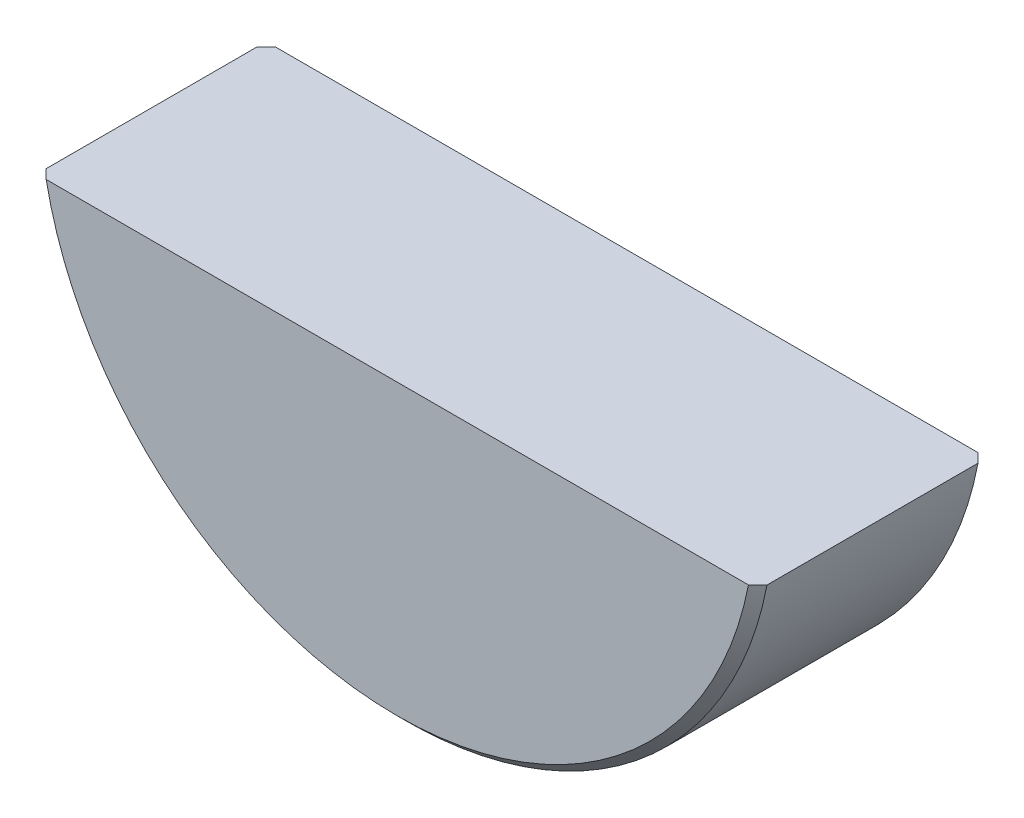
ISO-10303-21;
HEADER;
FILE_DESCRIPTION(('STEP AP214'),'2;1');
FILE_NAME('part.step','',(''),(''),'','','');
FILE_SCHEMA(('AUTOMOTIVE_DESIGN { 1 0 10303 214 1 1 1 1 }'));
ENDSEC;
DATA;
#1=APPLICATION_CONTEXT('core data for automotive mechanical design processes');
#2=APPLICATION_PROTOCOL_DEFINITION('international standard','automotive_design',2000,#1);
#3=PRODUCT_CONTEXT('',#1,'mechanical');
#4=PRODUCT('Part','Part','',(#3));
#5=PRODUCT_RELATED_PRODUCT_CATEGORY('part','',(#4));
#6=PRODUCT_DEFINITION_FORMATION('','',#4);
#7=PRODUCT_DEFINITION_CONTEXT('part definition',#1,'design');
#8=PRODUCT_DEFINITION('design','',#6,#7);
#9=PRODUCT_DEFINITION_SHAPE('','',#8);
#10=(LENGTH_UNIT() NAMED_UNIT(*) SI_UNIT(.MILLI.,.METRE.));
#11=(NAMED_UNIT(*) PLANE_ANGLE_UNIT() SI_UNIT($,.RADIAN.));
#12=(NAMED_UNIT(*) SI_UNIT($,.STERADIAN.) SOLID_ANGLE_UNIT());
#13=UNCERTAINTY_MEASURE_WITH_UNIT(LENGTH_MEASURE(1.E-05),#10,'distance_accuracy_value','');
#14=(GEOMETRIC_REPRESENTATION_CONTEXT(3) GLOBAL_UNCERTAINTY_ASSIGNED_CONTEXT((#13)) GLOBAL_UNIT_ASSIGNED_CONTEXT((#10,
#11,#12)) REPRESENTATION_CONTEXT('',''));
#15=CARTESIAN_POINT('',(0.,0.,0.));
#16=DIRECTION('',(0.,0.,1.));
#17=DIRECTION('',(1.,0.,0.));
#18=AXIS2_PLACEMENT_3D('',#15,#16,#17);
#19=CARTESIAN_POINT('',(0.,0.,10.));
#20=DIRECTION('',(0.,0.,-1.));
#21=DIRECTION('',(-1.,0.,0.));
#22=AXIS2_PLACEMENT_3D('',#19,#20,#21);
#23=CYLINDRICAL_SURFACE('',#22,16.);
#24=DIRECTION('',(0.,0.,-1.));
#25=VECTOR('',#24,1.);
#26=CARTESIAN_POINT('',(-15.7162336455017,-3.,10.));
#27=LINE('',#26,#25);
#28=CARTESIAN_POINT('',(-15.7162336455017,-3.,9.60000000000001));
#29=VERTEX_POINT('',#28);
#30=CARTESIAN_POINT('',(-15.7162336455017,-3.,0.399999999999999));
#31=VERTEX_POINT('',#30);
#32=EDGE_CURVE('E94',#29,#31,#27,.T.);
#33=ORIENTED_EDGE('',*,*,#32,.T.);
#34=CARTESIAN_POINT('',(0.,0.,0.399999999999999));
#35=DIRECTION('',(0.,0.,1.));
#36=DIRECTION('',(1.,0.,0.));
#37=AXIS2_PLACEMENT_3D('',#34,#35,#36);
#38=CIRCLE('',#37,16.);
#39=CARTESIAN_POINT('',(15.7162336455017,-3.,0.399999999999999));
#40=VERTEX_POINT('',#39);
#41=EDGE_CURVE('E93',#31,#40,#38,.T.);
#42=ORIENTED_EDGE('',*,*,#41,.T.);
#43=DIRECTION('',(0.,0.,-1.));
#44=VECTOR('',#43,1.);
#45=CARTESIAN_POINT('',(15.7162336455017,-3.,10.));
#46=LINE('',#45,#44);
#47=CARTESIAN_POINT('',(15.7162336455017,-3.,9.60000000000001));
#48=VERTEX_POINT('',#47);
#49=EDGE_CURVE('E84',#48,#40,#46,.T.);
#50=ORIENTED_EDGE('',*,*,#49,.F.);
#51=CARTESIAN_POINT('',(0.,0.,9.60000000000001));
#52=DIRECTION('',(0.,0.,1.));
#53=DIRECTION('',(1.,0.,0.));
#54=AXIS2_PLACEMENT_3D('',#51,#52,#53);
#55=CIRCLE('',#54,16.);
#56=EDGE_CURVE('E91',#48,#29,#55,.F.);
#57=ORIENTED_EDGE('',*,*,#56,.T.);
#58=EDGE_LOOP('',(#33,#42,#50,#57));
#59=FACE_BOUND('',#58,.T.);
#60=ADVANCED_FACE('F40',(#59),#23,.T.);
#61=CARTESIAN_POINT('',(-15.7162336455017,-3.,10.));
#62=DIRECTION('',(0.,-1.,0.));
#63=DIRECTION('',(0.,0.,-1.));
#64=AXIS2_PLACEMENT_3D('',#61,#62,#63);
#65=PLANE('',#64);
#66=ORIENTED_EDGE('',*,*,#49,.T.);
#67=CARTESIAN_POINT('',(15.7162336455017,-3.,0.399999999999999));
#68=CARTESIAN_POINT('',(15.6483473164627,-3.,0.333317260136937));
#69=CARTESIAN_POINT('',(15.5804530970414,-3.,0.266642556877982));
#70=CARTESIAN_POINT('',(15.4446488774101,-3.,0.133309223544644));
#71=CARTESIAN_POINT('',(15.3767388772001,-3.,0.0666505934702655));
#72=CARTESIAN_POINT('',(15.3088209866077,-3.,0.));
#73=B_SPLINE_CURVE_WITH_KNOTS('',3,(#67,#68,#69,#70,#71,#72),.UNSPECIFIED.,.F.,.F.,(4,2,4),(0.,
0.28547551518384,0.57095103046892),.UNSPECIFIED.);
#74=CARTESIAN_POINT('',(15.3088209866077,-3.,0.));
#75=VERTEX_POINT('',#74);
#76=EDGE_CURVE('E125',#40,#75,#73,.T.);
#77=ORIENTED_EDGE('',*,*,#76,.T.);
#78=DIRECTION('',(-1.,0.,0.));
#79=VECTOR('',#78,1.);
#80=CARTESIAN_POINT('',(-15.7162336455017,-3.,0.));
#81=LINE('',#80,#79);
#82=CARTESIAN_POINT('',(-15.3088209866077,-3.,0.));
#83=VERTEX_POINT('',#82);
#84=EDGE_CURVE('E178',#75,#83,#81,.T.);
#85=ORIENTED_EDGE('',*,*,#84,.T.);
#86=CARTESIAN_POINT('',(-15.3088209866077,-3.,0.));
#87=CARTESIAN_POINT('',(-15.3767388772001,-3.,0.0666505934702665));
#88=CARTESIAN_POINT('',(-15.4446488774101,-3.,0.133309223544645));
#89=CARTESIAN_POINT('',(-15.5804530970414,-3.,0.266642556877984));
#90=CARTESIAN_POINT('',(-15.6483473164627,-3.,0.333317260136938));
#91=CARTESIAN_POINT('',(-15.7162336455017,-3.,0.399999999999999));
#92=B_SPLINE_CURVE_WITH_KNOTS('',3,(#86,#87,#88,#89,#90,#91),.UNSPECIFIED.,.F.,.F.,(4,2,4),(0.,
0.285475515285079,0.570951030468918),.UNSPECIFIED.);
#93=EDGE_CURVE('E86',#83,#31,#92,.T.);
#94=ORIENTED_EDGE('',*,*,#93,.T.);
#95=ORIENTED_EDGE('',*,*,#32,.F.);
#96=CARTESIAN_POINT('',(-15.7162336455017,-3.,9.60000000000001));
#97=CARTESIAN_POINT('',(-15.6483473164627,-3.,9.66668273986307));
#98=CARTESIAN_POINT('',(-15.5804530970414,-3.,9.73335744312202));
#99=CARTESIAN_POINT('',(-15.4446488774101,-3.,9.86669077645536));
#100=CARTESIAN_POINT('',(-15.3767388772001,-3.,9.93334940652974));
#101=CARTESIAN_POINT('',(-15.3088209866077,-3.,10.));
#102=B_SPLINE_CURVE_WITH_KNOTS('',3,(#96,#97,#98,#99,#100,#101),.UNSPECIFIED.,.F.,.F.,(4,2,4),
(0.,0.285475515183831,0.570951030468905),.UNSPECIFIED.);
#103=CARTESIAN_POINT('',(-15.3088209866077,-3.,10.));
#104=VERTEX_POINT('',#103);
#105=EDGE_CURVE('E56',#29,#104,#102,.T.);
#106=ORIENTED_EDGE('',*,*,#105,.T.);
#107=DIRECTION('',(-1.,0.,0.));
#108=VECTOR('',#107,1.);
#109=CARTESIAN_POINT('',(-15.7162336455017,-3.,10.));
#110=LINE('',#109,#108);
#111=CARTESIAN_POINT('',(15.3088209866077,-3.,10.));
#112=VERTEX_POINT('',#111);
#113=EDGE_CURVE('E85',#112,#104,#110,.T.);
#114=ORIENTED_EDGE('',*,*,#113,.F.);
#115=CARTESIAN_POINT('',(15.3088209866077,-3.,10.));
#116=CARTESIAN_POINT('',(15.3767388772001,-3.,9.93334940652974));
#117=CARTESIAN_POINT('',(15.4446488774101,-3.,9.86669077645536));
#118=CARTESIAN_POINT('',(15.5804530970414,-3.,9.73335744312202));
#119=CARTESIAN_POINT('',(15.6483473164627,-3.,9.66668273986307));
#120=CARTESIAN_POINT('',(15.7162336455017,-3.,9.60000000000001));
#121=B_SPLINE_CURVE_WITH_KNOTS('',3,(#115,#116,#117,#118,#119,#120),.UNSPECIFIED.,.F.,.F.,(4,2,
4),(0.,0.285475515285072,0.570951030468904),.UNSPECIFIED.);
#122=EDGE_CURVE('E64',#112,#48,#121,.T.);
#123=ORIENTED_EDGE('',*,*,#122,.T.);
#124=EDGE_LOOP('',(#66,#77,#85,#94,#95,#106,#114,#123));
#125=FACE_BOUND('',#124,.T.);
#126=ADVANCED_FACE('F83',(#125),#65,.F.);
#127=CARTESIAN_POINT('',(0.,0.,10.));
#128=DIRECTION('',(0.,0.,1.));
#129=DIRECTION('',(1.,0.,0.));
#130=AXIS2_PLACEMENT_3D('',#127,#128,#129);
#131=PLANE('',#130);
#132=ORIENTED_EDGE('',*,*,#113,.T.);
#133=CARTESIAN_POINT('',(0.,0.,10.));
#134=DIRECTION('',(0.,0.,1.));
#135=DIRECTION('',(1.,0.,0.));
#136=AXIS2_PLACEMENT_3D('',#133,#134,#135);
#137=CIRCLE('',#136,15.6);
#138=EDGE_CURVE('E11',#104,#112,#137,.T.);
#139=ORIENTED_EDGE('',*,*,#138,.T.);
#140=EDGE_LOOP('',(#132,#139));
#141=FACE_BOUND('',#140,.T.);
#142=ADVANCED_FACE('F114',(#141),#131,.T.);
#143=CARTESIAN_POINT('',(0.,0.,0.));
#144=DIRECTION('',(0.,0.,1.));
#145=DIRECTION('',(1.,0.,0.));
#146=AXIS2_PLACEMENT_3D('',#143,#144,#145);
#147=PLANE('',#146);
#148=ORIENTED_EDGE('',*,*,#84,.F.);
#149=CARTESIAN_POINT('',(0.,0.,0.));
#150=DIRECTION('',(0.,0.,1.));
#151=DIRECTION('',(1.,0.,0.));
#152=AXIS2_PLACEMENT_3D('',#149,#150,#151);
#153=CIRCLE('',#152,15.6);
#154=EDGE_CURVE('E49',#75,#83,#153,.F.);
#155=ORIENTED_EDGE('',*,*,#154,.T.);
#156=EDGE_LOOP('',(#148,#155));
#157=FACE_BOUND('',#156,.T.);
#158=ADVANCED_FACE('F115',(#157),#147,.F.);
#159=CARTESIAN_POINT('',(0.,0.,0.399999999999999));
#160=DIRECTION('',(0.,0.,1.));
#161=DIRECTION('',(1.,0.,0.));
#162=AXIS2_PLACEMENT_3D('',#159,#160,#161);
#163=CONICAL_SURFACE('',#162,16.,0.785398163397448);
#164=ORIENTED_EDGE('',*,*,#93,.F.);
#165=ORIENTED_EDGE('',*,*,#154,.F.);
#166=ORIENTED_EDGE('',*,*,#76,.F.);
#167=ORIENTED_EDGE('',*,*,#41,.F.);
#168=EDGE_LOOP('',(#164,#165,#166,#167));
#169=FACE_BOUND('',#168,.T.);
#170=ADVANCED_FACE('F130',(#169),#163,.T.);
#171=CARTESIAN_POINT('',(0.,0.,10.));
#172=DIRECTION('',(0.,0.,-1.));
#173=DIRECTION('',(-1.,0.,0.));
#174=AXIS2_PLACEMENT_3D('',#171,#172,#173);
#175=CONICAL_SURFACE('',#174,15.6,0.785398163397453);
#176=ORIENTED_EDGE('',*,*,#105,.F.);
#177=ORIENTED_EDGE('',*,*,#56,.F.);
#178=ORIENTED_EDGE('',*,*,#122,.F.);
#179=ORIENTED_EDGE('',*,*,#138,.F.);
#180=EDGE_LOOP('',(#176,#177,#178,#179));
#181=FACE_BOUND('',#180,.T.);
#182=ADVANCED_FACE('F42',(#181),#175,.T.);
#183=CLOSED_SHELL('',(#60,#126,#142,#158,#170,#182));
#184=MANIFOLD_SOLID_BREP('B2',#183);
#185=ADVANCED_BREP_SHAPE_REPRESENTATION('',(#18,#184),#14);
#186=SHAPE_DEFINITION_REPRESENTATION(#9,#185);
ENDSEC;
END-ISO-10303-21;
